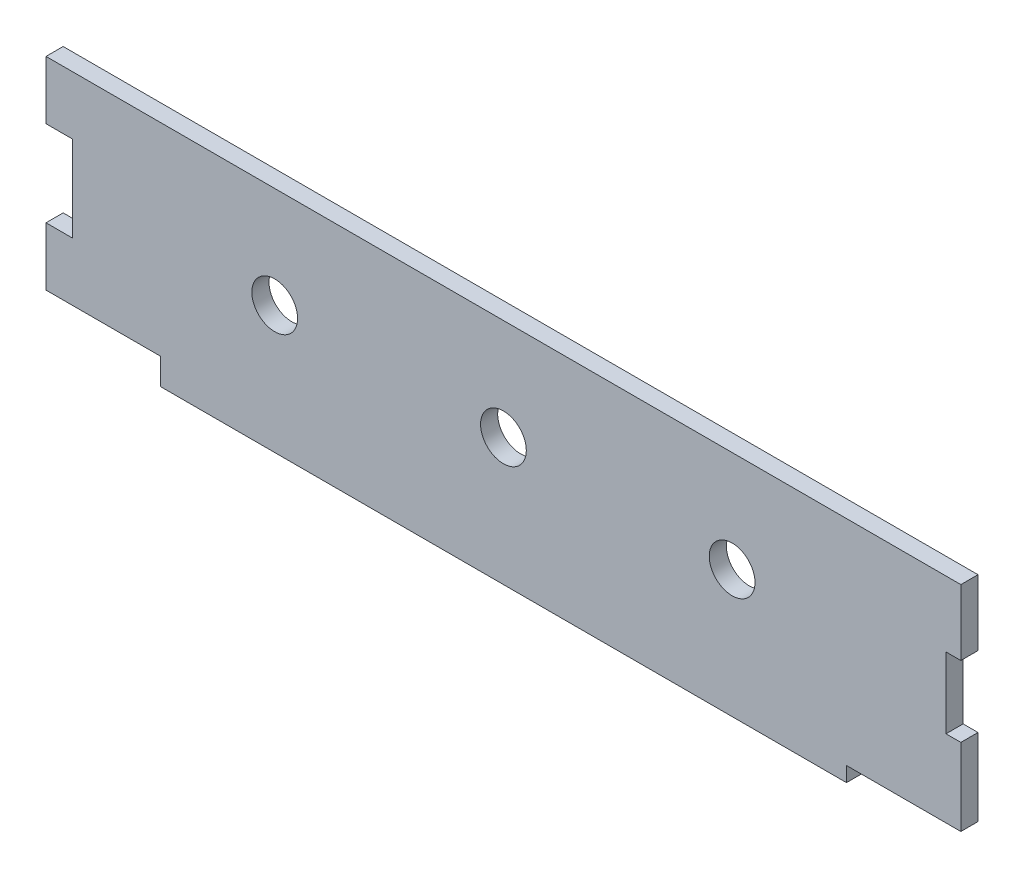
ISO-10303-21;
HEADER;
FILE_DESCRIPTION(('STEP AP214'),'2;1');
FILE_NAME('part.step','',(''),(''),'','','');
FILE_SCHEMA(('AUTOMOTIVE_DESIGN { 1 0 10303 214 1 1 1 1 }'));
ENDSEC;
DATA;
#1=APPLICATION_CONTEXT('core data for automotive mechanical design processes');
#2=APPLICATION_PROTOCOL_DEFINITION('international standard','automotive_design',2000,#1);
#3=PRODUCT_CONTEXT('',#1,'mechanical');
#4=PRODUCT('Part','Part','',(#3));
#5=PRODUCT_RELATED_PRODUCT_CATEGORY('part','',(#4));
#6=PRODUCT_DEFINITION_FORMATION('','',#4);
#7=PRODUCT_DEFINITION_CONTEXT('part definition',#1,'design');
#8=PRODUCT_DEFINITION('design','',#6,#7);
#9=PRODUCT_DEFINITION_SHAPE('','',#8);
#10=(LENGTH_UNIT() NAMED_UNIT(*) SI_UNIT(.MILLI.,.METRE.));
#11=(NAMED_UNIT(*) PLANE_ANGLE_UNIT() SI_UNIT($,.RADIAN.));
#12=(NAMED_UNIT(*) SI_UNIT($,.STERADIAN.) SOLID_ANGLE_UNIT());
#13=UNCERTAINTY_MEASURE_WITH_UNIT(LENGTH_MEASURE(1.E-05),#10,'distance_accuracy_value','');
#14=(GEOMETRIC_REPRESENTATION_CONTEXT(3) GLOBAL_UNCERTAINTY_ASSIGNED_CONTEXT((#13)) GLOBAL_UNIT_ASSIGNED_CONTEXT((#10,
#11,#12)) REPRESENTATION_CONTEXT('',''));
#15=CARTESIAN_POINT('',(0.,0.,0.));
#16=DIRECTION('',(0.,0.,1.));
#17=DIRECTION('',(1.,0.,0.));
#18=AXIS2_PLACEMENT_3D('',#15,#16,#17);
#19=CARTESIAN_POINT('',(0.,0.,1.5));
#20=DIRECTION('',(0.,0.,-1.));
#21=DIRECTION('',(-1.,0.,0.));
#22=AXIS2_PLACEMENT_3D('',#19,#20,#21);
#23=PLANE('',#22);
#24=DIRECTION('',(0.,-1.,0.));
#25=VECTOR('',#24,1.);
#26=CARTESIAN_POINT('',(-40.,3.74999999999999,1.5));
#27=LINE('',#26,#25);
#28=CARTESIAN_POINT('',(-40.0000000000001,8.84999999999999,1.5));
#29=VERTEX_POINT('',#28);
#30=CARTESIAN_POINT('',(-40.,3.74999999999999,1.5));
#31=VERTEX_POINT('',#30);
#32=EDGE_CURVE('E209',#29,#31,#27,.T.);
#33=ORIENTED_EDGE('',*,*,#32,.T.);
#34=DIRECTION('',(1.,0.,0.));
#35=VECTOR('',#34,1.);
#36=CARTESIAN_POINT('',(-37.7,3.74999999999999,1.5));
#37=LINE('',#36,#35);
#38=CARTESIAN_POINT('',(-37.7,3.74999999999999,1.5));
#39=VERTEX_POINT('',#38);
#40=EDGE_CURVE('E117',#31,#39,#37,.T.);
#41=ORIENTED_EDGE('',*,*,#40,.T.);
#42=DIRECTION('',(0.,-1.,0.));
#43=VECTOR('',#42,1.);
#44=CARTESIAN_POINT('',(-37.7,-3.75000000000001,1.5));
#45=LINE('',#44,#43);
#46=CARTESIAN_POINT('',(-37.7,-3.75000000000001,1.5));
#47=VERTEX_POINT('',#46);
#48=EDGE_CURVE('E248',#39,#47,#45,.T.);
#49=ORIENTED_EDGE('',*,*,#48,.T.);
#50=DIRECTION('',(-1.,0.,0.));
#51=VECTOR('',#50,1.);
#52=CARTESIAN_POINT('',(-40.,-3.75000000000001,1.5));
#53=LINE('',#52,#51);
#54=CARTESIAN_POINT('',(-40.,-3.75000000000001,1.5));
#55=VERTEX_POINT('',#54);
#56=EDGE_CURVE('E267',#47,#55,#53,.T.);
#57=ORIENTED_EDGE('',*,*,#56,.T.);
#58=DIRECTION('',(0.,-1.,0.));
#59=VECTOR('',#58,1.);
#60=CARTESIAN_POINT('',(-40.,-8.85000000000001,1.5));
#61=LINE('',#60,#59);
#62=CARTESIAN_POINT('',(-40.,-8.85000000000001,1.5));
#63=VERTEX_POINT('',#62);
#64=EDGE_CURVE('E264',#55,#63,#61,.T.);
#65=ORIENTED_EDGE('',*,*,#64,.T.);
#66=DIRECTION('',(1.,0.,0.));
#67=VECTOR('',#66,1.);
#68=CARTESIAN_POINT('',(-30.,-8.85,1.5));
#69=LINE('',#68,#67);
#70=CARTESIAN_POINT('',(-30.,-8.85,1.5));
#71=VERTEX_POINT('',#70);
#72=EDGE_CURVE('E266',#63,#71,#69,.T.);
#73=ORIENTED_EDGE('',*,*,#72,.T.);
#74=DIRECTION('',(0.,-1.,0.));
#75=VECTOR('',#74,1.);
#76=CARTESIAN_POINT('',(-30.,-11.15,1.5));
#77=LINE('',#76,#75);
#78=CARTESIAN_POINT('',(-30.,-11.15,1.5));
#79=VERTEX_POINT('',#78);
#80=EDGE_CURVE('E269',#71,#79,#77,.T.);
#81=ORIENTED_EDGE('',*,*,#80,.T.);
#82=DIRECTION('',(1.,0.,0.));
#83=VECTOR('',#82,1.);
#84=CARTESIAN_POINT('',(30.,-11.15,1.5));
#85=LINE('',#84,#83);
#86=CARTESIAN_POINT('',(30.,-11.15,1.5));
#87=VERTEX_POINT('',#86);
#88=EDGE_CURVE('E275',#79,#87,#85,.T.);
#89=ORIENTED_EDGE('',*,*,#88,.T.);
#90=DIRECTION('',(0.,1.,0.));
#91=VECTOR('',#90,1.);
#92=CARTESIAN_POINT('',(30.,-9.84999999999999,1.5));
#93=LINE('',#92,#91);
#94=CARTESIAN_POINT('',(30.,-9.84999999999999,1.5));
#95=VERTEX_POINT('',#94);
#96=EDGE_CURVE('E277',#87,#95,#93,.T.);
#97=ORIENTED_EDGE('',*,*,#96,.T.);
#98=DIRECTION('',(1.,0.,0.));
#99=VECTOR('',#98,1.);
#100=CARTESIAN_POINT('',(40.,-9.84999999999999,1.5));
#101=LINE('',#100,#99);
#102=CARTESIAN_POINT('',(40.,-9.84999999999999,1.5));
#103=VERTEX_POINT('',#102);
#104=EDGE_CURVE('E279',#95,#103,#101,.T.);
#105=ORIENTED_EDGE('',*,*,#104,.T.);
#106=DIRECTION('',(0.,1.,0.));
#107=VECTOR('',#106,1.);
#108=CARTESIAN_POINT('',(40.,-3.1,1.5));
#109=LINE('',#108,#107);
#110=CARTESIAN_POINT('',(40.,-3.1,1.5));
#111=VERTEX_POINT('',#110);
#112=EDGE_CURVE('E281',#103,#111,#109,.T.);
#113=ORIENTED_EDGE('',*,*,#112,.T.);
#114=DIRECTION('',(-1.,0.,0.));
#115=VECTOR('',#114,1.);
#116=CARTESIAN_POINT('',(38.7,-3.1,1.5));
#117=LINE('',#116,#115);
#118=CARTESIAN_POINT('',(38.7,-3.1,1.5));
#119=VERTEX_POINT('',#118);
#120=EDGE_CURVE('E283',#111,#119,#117,.T.);
#121=ORIENTED_EDGE('',*,*,#120,.T.);
#122=DIRECTION('',(0.,1.,0.));
#123=VECTOR('',#122,1.);
#124=CARTESIAN_POINT('',(38.7,3.1,1.5));
#125=LINE('',#124,#123);
#126=CARTESIAN_POINT('',(38.7,3.1,1.5));
#127=VERTEX_POINT('',#126);
#128=EDGE_CURVE('E160',#119,#127,#125,.T.);
#129=ORIENTED_EDGE('',*,*,#128,.T.);
#130=DIRECTION('',(1.,0.,0.));
#131=VECTOR('',#130,1.);
#132=CARTESIAN_POINT('',(40.,3.1,1.5));
#133=LINE('',#132,#131);
#134=CARTESIAN_POINT('',(40.,3.1,1.5));
#135=VERTEX_POINT('',#134);
#136=EDGE_CURVE('E154',#127,#135,#133,.T.);
#137=ORIENTED_EDGE('',*,*,#136,.T.);
#138=DIRECTION('',(0.,1.,0.));
#139=VECTOR('',#138,1.);
#140=CARTESIAN_POINT('',(40.0000000000001,8.84999999999999,1.5));
#141=LINE('',#140,#139);
#142=CARTESIAN_POINT('',(40.0000000000001,8.84999999999999,1.5));
#143=VERTEX_POINT('',#142);
#144=EDGE_CURVE('E158',#135,#143,#141,.T.);
#145=ORIENTED_EDGE('',*,*,#144,.T.);
#146=DIRECTION('',(-1.,0.,0.));
#147=VECTOR('',#146,1.);
#148=CARTESIAN_POINT('',(-40.0000000000001,8.84999999999999,1.5));
#149=LINE('',#148,#147);
#150=EDGE_CURVE('E50',#143,#29,#149,.T.);
#151=ORIENTED_EDGE('',*,*,#150,.T.);
#152=EDGE_LOOP('',(#33,#41,#49,#57,#65,#73,#81,#89,#97,#105,#113,#121,#129,#137,#145,#151));
#153=FACE_BOUND('',#152,.T.);
#154=CARTESIAN_POINT('',(20.,0.,1.5));
#155=DIRECTION('',(0.,0.,1.));
#156=DIRECTION('',(1.,0.,0.));
#157=AXIS2_PLACEMENT_3D('',#154,#155,#156);
#158=CIRCLE('',#157,2.00000000000003);
#159=CARTESIAN_POINT('',(22.,0.,1.5));
#160=VERTEX_POINT('',#159);
#161=EDGE_CURVE('E182',#160,#160,#158,.T.);
#162=ORIENTED_EDGE('',*,*,#161,.F.);
#163=EDGE_LOOP('',(#162));
#164=FACE_BOUND('',#163,.T.);
#165=CARTESIAN_POINT('',(0.,0.,1.5));
#166=DIRECTION('',(0.,0.,1.));
#167=DIRECTION('',(1.,0.,0.));
#168=AXIS2_PLACEMENT_3D('',#165,#166,#167);
#169=CIRCLE('',#168,2.00000000000002);
#170=CARTESIAN_POINT('',(2.,0.,1.5));
#171=VERTEX_POINT('',#170);
#172=EDGE_CURVE('E337',#171,#171,#169,.T.);
#173=ORIENTED_EDGE('',*,*,#172,.F.);
#174=EDGE_LOOP('',(#173));
#175=FACE_BOUND('',#174,.T.);
#176=CARTESIAN_POINT('',(-20.,0.,1.5));
#177=DIRECTION('',(0.,0.,1.));
#178=DIRECTION('',(1.,0.,0.));
#179=AXIS2_PLACEMENT_3D('',#176,#177,#178);
#180=CIRCLE('',#179,2.00000000000003);
#181=CARTESIAN_POINT('',(-18.,0.,1.5));
#182=VERTEX_POINT('',#181);
#183=EDGE_CURVE('E328',#182,#182,#180,.T.);
#184=ORIENTED_EDGE('',*,*,#183,.F.);
#185=EDGE_LOOP('',(#184));
#186=FACE_BOUND('',#185,.T.);
#187=ADVANCED_FACE('F33',(#153,#164,#175,#186),#23,.F.);
#188=CARTESIAN_POINT('',(0.,0.,0.));
#189=DIRECTION('',(0.,0.,-1.));
#190=DIRECTION('',(-1.,0.,0.));
#191=AXIS2_PLACEMENT_3D('',#188,#189,#190);
#192=PLANE('',#191);
#193=CARTESIAN_POINT('',(0.,0.,0.));
#194=DIRECTION('',(0.,0.,1.));
#195=DIRECTION('',(1.,0.,0.));
#196=AXIS2_PLACEMENT_3D('',#193,#194,#195);
#197=CIRCLE('',#196,2.00000000000002);
#198=CARTESIAN_POINT('',(2.,0.,0.));
#199=VERTEX_POINT('',#198);
#200=EDGE_CURVE('E334',#199,#199,#197,.T.);
#201=ORIENTED_EDGE('',*,*,#200,.T.);
#202=EDGE_LOOP('',(#201));
#203=FACE_BOUND('',#202,.T.);
#204=DIRECTION('',(0.,-1.,0.));
#205=VECTOR('',#204,1.);
#206=CARTESIAN_POINT('',(-40.,3.74999999999999,0.));
#207=LINE('',#206,#205);
#208=CARTESIAN_POINT('',(-40.0000000000001,8.84999999999999,0.));
#209=VERTEX_POINT('',#208);
#210=CARTESIAN_POINT('',(-40.,3.74999999999999,0.));
#211=VERTEX_POINT('',#210);
#212=EDGE_CURVE('E178',#209,#211,#207,.T.);
#213=ORIENTED_EDGE('',*,*,#212,.F.);
#214=DIRECTION('',(-1.,0.,0.));
#215=VECTOR('',#214,1.);
#216=CARTESIAN_POINT('',(-40.0000000000001,8.84999999999999,0.));
#217=LINE('',#216,#215);
#218=CARTESIAN_POINT('',(40.0000000000001,8.84999999999999,0.));
#219=VERTEX_POINT('',#218);
#220=EDGE_CURVE('E109',#219,#209,#217,.T.);
#221=ORIENTED_EDGE('',*,*,#220,.F.);
#222=DIRECTION('',(0.,1.,0.));
#223=VECTOR('',#222,1.);
#224=CARTESIAN_POINT('',(40.0000000000001,8.84999999999999,0.));
#225=LINE('',#224,#223);
#226=CARTESIAN_POINT('',(40.,3.1,0.));
#227=VERTEX_POINT('',#226);
#228=EDGE_CURVE('E103',#227,#219,#225,.T.);
#229=ORIENTED_EDGE('',*,*,#228,.F.);
#230=DIRECTION('',(1.,0.,0.));
#231=VECTOR('',#230,1.);
#232=CARTESIAN_POINT('',(40.,3.1,0.));
#233=LINE('',#232,#231);
#234=CARTESIAN_POINT('',(38.7,3.1,0.));
#235=VERTEX_POINT('',#234);
#236=EDGE_CURVE('E168',#235,#227,#233,.T.);
#237=ORIENTED_EDGE('',*,*,#236,.F.);
#238=DIRECTION('',(0.,1.,0.));
#239=VECTOR('',#238,1.);
#240=CARTESIAN_POINT('',(38.7,3.1,0.));
#241=LINE('',#240,#239);
#242=CARTESIAN_POINT('',(38.7,-3.1,0.));
#243=VERTEX_POINT('',#242);
#244=EDGE_CURVE('E204',#243,#235,#241,.T.);
#245=ORIENTED_EDGE('',*,*,#244,.F.);
#246=DIRECTION('',(-1.,0.,0.));
#247=VECTOR('',#246,1.);
#248=CARTESIAN_POINT('',(38.7,-3.1,0.));
#249=LINE('',#248,#247);
#250=CARTESIAN_POINT('',(40.,-3.1,0.));
#251=VERTEX_POINT('',#250);
#252=EDGE_CURVE('E202',#251,#243,#249,.T.);
#253=ORIENTED_EDGE('',*,*,#252,.F.);
#254=DIRECTION('',(0.,1.,0.));
#255=VECTOR('',#254,1.);
#256=CARTESIAN_POINT('',(40.,-3.1,0.));
#257=LINE('',#256,#255);
#258=CARTESIAN_POINT('',(40.,-9.84999999999999,0.));
#259=VERTEX_POINT('',#258);
#260=EDGE_CURVE('E200',#259,#251,#257,.T.);
#261=ORIENTED_EDGE('',*,*,#260,.F.);
#262=DIRECTION('',(1.,0.,0.));
#263=VECTOR('',#262,1.);
#264=CARTESIAN_POINT('',(40.,-9.84999999999999,0.));
#265=LINE('',#264,#263);
#266=CARTESIAN_POINT('',(30.,-9.84999999999999,0.));
#267=VERTEX_POINT('',#266);
#268=EDGE_CURVE('E198',#267,#259,#265,.T.);
#269=ORIENTED_EDGE('',*,*,#268,.F.);
#270=DIRECTION('',(0.,1.,0.));
#271=VECTOR('',#270,1.);
#272=CARTESIAN_POINT('',(30.,-9.84999999999999,0.));
#273=LINE('',#272,#271);
#274=CARTESIAN_POINT('',(30.,-11.15,0.));
#275=VERTEX_POINT('',#274);
#276=EDGE_CURVE('E196',#275,#267,#273,.T.);
#277=ORIENTED_EDGE('',*,*,#276,.F.);
#278=DIRECTION('',(1.,0.,0.));
#279=VECTOR('',#278,1.);
#280=CARTESIAN_POINT('',(30.,-11.15,0.));
#281=LINE('',#280,#279);
#282=CARTESIAN_POINT('',(-30.,-11.15,0.));
#283=VERTEX_POINT('',#282);
#284=EDGE_CURVE('E194',#283,#275,#281,.T.);
#285=ORIENTED_EDGE('',*,*,#284,.F.);
#286=DIRECTION('',(0.,-1.,0.));
#287=VECTOR('',#286,1.);
#288=CARTESIAN_POINT('',(-30.,-11.15,0.));
#289=LINE('',#288,#287);
#290=CARTESIAN_POINT('',(-30.,-8.85,0.));
#291=VERTEX_POINT('',#290);
#292=EDGE_CURVE('E192',#291,#283,#289,.T.);
#293=ORIENTED_EDGE('',*,*,#292,.F.);
#294=DIRECTION('',(1.,0.,0.));
#295=VECTOR('',#294,1.);
#296=CARTESIAN_POINT('',(-30.,-8.85,0.));
#297=LINE('',#296,#295);
#298=CARTESIAN_POINT('',(-40.,-8.85000000000001,0.));
#299=VERTEX_POINT('',#298);
#300=EDGE_CURVE('E190',#299,#291,#297,.T.);
#301=ORIENTED_EDGE('',*,*,#300,.F.);
#302=DIRECTION('',(0.,-1.,0.));
#303=VECTOR('',#302,1.);
#304=CARTESIAN_POINT('',(-40.,-8.85000000000001,0.));
#305=LINE('',#304,#303);
#306=CARTESIAN_POINT('',(-40.,-3.75000000000001,0.));
#307=VERTEX_POINT('',#306);
#308=EDGE_CURVE('E188',#307,#299,#305,.T.);
#309=ORIENTED_EDGE('',*,*,#308,.F.);
#310=DIRECTION('',(-1.,0.,0.));
#311=VECTOR('',#310,1.);
#312=CARTESIAN_POINT('',(-40.,-3.75000000000001,0.));
#313=LINE('',#312,#311);
#314=CARTESIAN_POINT('',(-37.7,-3.75000000000001,0.));
#315=VERTEX_POINT('',#314);
#316=EDGE_CURVE('E186',#315,#307,#313,.T.);
#317=ORIENTED_EDGE('',*,*,#316,.F.);
#318=DIRECTION('',(0.,-1.,0.));
#319=VECTOR('',#318,1.);
#320=CARTESIAN_POINT('',(-37.7,-3.75000000000001,0.));
#321=LINE('',#320,#319);
#322=CARTESIAN_POINT('',(-37.7,3.74999999999999,0.));
#323=VERTEX_POINT('',#322);
#324=EDGE_CURVE('E184',#323,#315,#321,.T.);
#325=ORIENTED_EDGE('',*,*,#324,.F.);
#326=DIRECTION('',(1.,0.,0.));
#327=VECTOR('',#326,1.);
#328=CARTESIAN_POINT('',(-37.7,3.74999999999999,0.));
#329=LINE('',#328,#327);
#330=EDGE_CURVE('E181',#211,#323,#329,.T.);
#331=ORIENTED_EDGE('',*,*,#330,.F.);
#332=EDGE_LOOP('',(#213,#221,#229,#237,#245,#253,#261,#269,#277,#285,#293,#301,#309,#317,#325,#331));
#333=FACE_BOUND('',#332,.T.);
#334=CARTESIAN_POINT('',(20.,0.,0.));
#335=DIRECTION('',(0.,0.,1.));
#336=DIRECTION('',(1.,0.,0.));
#337=AXIS2_PLACEMENT_3D('',#334,#335,#336);
#338=CIRCLE('',#337,2.00000000000003);
#339=CARTESIAN_POINT('',(22.,0.,0.));
#340=VERTEX_POINT('',#339);
#341=EDGE_CURVE('E340',#340,#340,#338,.T.);
#342=ORIENTED_EDGE('',*,*,#341,.T.);
#343=EDGE_LOOP('',(#342));
#344=FACE_BOUND('',#343,.T.);
#345=CARTESIAN_POINT('',(-20.,0.,0.));
#346=DIRECTION('',(0.,0.,1.));
#347=DIRECTION('',(1.,0.,0.));
#348=AXIS2_PLACEMENT_3D('',#345,#346,#347);
#349=CIRCLE('',#348,2.00000000000003);
#350=CARTESIAN_POINT('',(-18.,0.,0.));
#351=VERTEX_POINT('',#350);
#352=EDGE_CURVE('E331',#351,#351,#349,.T.);
#353=ORIENTED_EDGE('',*,*,#352,.T.);
#354=EDGE_LOOP('',(#353));
#355=FACE_BOUND('',#354,.T.);
#356=ADVANCED_FACE('F252',(#203,#333,#344,#355),#192,.T.);
#357=CARTESIAN_POINT('',(-40.,3.74999999999999,1.5));
#358=DIRECTION('',(1.,0.,0.));
#359=DIRECTION('',(0.,1.,0.));
#360=AXIS2_PLACEMENT_3D('',#357,#358,#359);
#361=PLANE('',#360);
#362=ORIENTED_EDGE('',*,*,#212,.T.);
#363=DIRECTION('',(0.,0.,-1.));
#364=VECTOR('',#363,1.);
#365=CARTESIAN_POINT('',(-40.,3.74999999999999,1.5));
#366=LINE('',#365,#364);
#367=EDGE_CURVE('E11',#31,#211,#366,.T.);
#368=ORIENTED_EDGE('',*,*,#367,.F.);
#369=ORIENTED_EDGE('',*,*,#32,.F.);
#370=DIRECTION('',(0.,0.,-1.));
#371=VECTOR('',#370,1.);
#372=CARTESIAN_POINT('',(-40.0000000000001,8.84999999999999,1.5));
#373=LINE('',#372,#371);
#374=EDGE_CURVE('E174',#29,#209,#373,.T.);
#375=ORIENTED_EDGE('',*,*,#374,.T.);
#376=EDGE_LOOP('',(#362,#368,#369,#375));
#377=FACE_BOUND('',#376,.T.);
#378=ADVANCED_FACE('F35',(#377),#361,.F.);
#379=CARTESIAN_POINT('',(-37.7,3.74999999999999,1.5));
#380=DIRECTION('',(0.,1.,0.));
#381=DIRECTION('',(-1.,0.,0.));
#382=AXIS2_PLACEMENT_3D('',#379,#380,#381);
#383=PLANE('',#382);
#384=ORIENTED_EDGE('',*,*,#330,.T.);
#385=DIRECTION('',(0.,0.,-1.));
#386=VECTOR('',#385,1.);
#387=CARTESIAN_POINT('',(-37.7,3.74999999999999,1.5));
#388=LINE('',#387,#386);
#389=EDGE_CURVE('E42',#39,#323,#388,.T.);
#390=ORIENTED_EDGE('',*,*,#389,.F.);
#391=ORIENTED_EDGE('',*,*,#40,.F.);
#392=ORIENTED_EDGE('',*,*,#367,.T.);
#393=EDGE_LOOP('',(#384,#390,#391,#392));
#394=FACE_BOUND('',#393,.T.);
#395=ADVANCED_FACE('F483',(#394),#383,.F.);
#396=CARTESIAN_POINT('',(-37.7,-3.75000000000001,1.5));
#397=DIRECTION('',(1.,0.,0.));
#398=DIRECTION('',(0.,1.,0.));
#399=AXIS2_PLACEMENT_3D('',#396,#397,#398);
#400=PLANE('',#399);
#401=ORIENTED_EDGE('',*,*,#324,.T.);
#402=DIRECTION('',(0.,0.,-1.));
#403=VECTOR('',#402,1.);
#404=CARTESIAN_POINT('',(-37.7,-3.75000000000001,1.5));
#405=LINE('',#404,#403);
#406=EDGE_CURVE('E240',#47,#315,#405,.T.);
#407=ORIENTED_EDGE('',*,*,#406,.F.);
#408=ORIENTED_EDGE('',*,*,#48,.F.);
#409=ORIENTED_EDGE('',*,*,#389,.T.);
#410=EDGE_LOOP('',(#401,#407,#408,#409));
#411=FACE_BOUND('',#410,.T.);
#412=ADVANCED_FACE('F246',(#411),#400,.F.);
#413=CARTESIAN_POINT('',(-40.,-3.75000000000001,1.5));
#414=DIRECTION('',(0.,-1.,0.));
#415=DIRECTION('',(0.,0.,-1.));
#416=AXIS2_PLACEMENT_3D('',#413,#414,#415);
#417=PLANE('',#416);
#418=ORIENTED_EDGE('',*,*,#316,.T.);
#419=DIRECTION('',(0.,0.,-1.));
#420=VECTOR('',#419,1.);
#421=CARTESIAN_POINT('',(-40.,-3.75000000000001,1.5));
#422=LINE('',#421,#420);
#423=EDGE_CURVE('E237',#55,#307,#422,.T.);
#424=ORIENTED_EDGE('',*,*,#423,.F.);
#425=ORIENTED_EDGE('',*,*,#56,.F.);
#426=ORIENTED_EDGE('',*,*,#406,.T.);
#427=EDGE_LOOP('',(#418,#424,#425,#426));
#428=FACE_BOUND('',#427,.T.);
#429=ADVANCED_FACE('F258',(#428),#417,.F.);
#430=CARTESIAN_POINT('',(-40.,-8.85000000000001,1.5));
#431=DIRECTION('',(1.,0.,0.));
#432=DIRECTION('',(0.,1.,0.));
#433=AXIS2_PLACEMENT_3D('',#430,#431,#432);
#434=PLANE('',#433);
#435=ORIENTED_EDGE('',*,*,#308,.T.);
#436=DIRECTION('',(0.,0.,-1.));
#437=VECTOR('',#436,1.);
#438=CARTESIAN_POINT('',(-40.,-8.85000000000001,1.5));
#439=LINE('',#438,#437);
#440=EDGE_CURVE('E234',#63,#299,#439,.T.);
#441=ORIENTED_EDGE('',*,*,#440,.F.);
#442=ORIENTED_EDGE('',*,*,#64,.F.);
#443=ORIENTED_EDGE('',*,*,#423,.T.);
#444=EDGE_LOOP('',(#435,#441,#442,#443));
#445=FACE_BOUND('',#444,.T.);
#446=ADVANCED_FACE('F262',(#445),#434,.F.);
#447=CARTESIAN_POINT('',(-30.,-8.85,1.5));
#448=DIRECTION('',(0.,1.,0.));
#449=DIRECTION('',(-1.,0.,0.));
#450=AXIS2_PLACEMENT_3D('',#447,#448,#449);
#451=PLANE('',#450);
#452=ORIENTED_EDGE('',*,*,#300,.T.);
#453=DIRECTION('',(0.,0.,-1.));
#454=VECTOR('',#453,1.);
#455=CARTESIAN_POINT('',(-30.,-8.85,1.5));
#456=LINE('',#455,#454);
#457=EDGE_CURVE('E231',#71,#291,#456,.T.);
#458=ORIENTED_EDGE('',*,*,#457,.F.);
#459=ORIENTED_EDGE('',*,*,#72,.F.);
#460=ORIENTED_EDGE('',*,*,#440,.T.);
#461=EDGE_LOOP('',(#452,#458,#459,#460));
#462=FACE_BOUND('',#461,.T.);
#463=ADVANCED_FACE('F448',(#462),#451,.F.);
#464=CARTESIAN_POINT('',(-30.,-11.15,1.5));
#465=DIRECTION('',(1.,0.,0.));
#466=DIRECTION('',(0.,1.,0.));
#467=AXIS2_PLACEMENT_3D('',#464,#465,#466);
#468=PLANE('',#467);
#469=ORIENTED_EDGE('',*,*,#292,.T.);
#470=DIRECTION('',(0.,0.,-1.));
#471=VECTOR('',#470,1.);
#472=CARTESIAN_POINT('',(-30.,-11.15,1.5));
#473=LINE('',#472,#471);
#474=EDGE_CURVE('E228',#79,#283,#473,.T.);
#475=ORIENTED_EDGE('',*,*,#474,.F.);
#476=ORIENTED_EDGE('',*,*,#80,.F.);
#477=ORIENTED_EDGE('',*,*,#457,.T.);
#478=EDGE_LOOP('',(#469,#475,#476,#477));
#479=FACE_BOUND('',#478,.T.);
#480=ADVANCED_FACE('F438',(#479),#468,.F.);
#481=CARTESIAN_POINT('',(30.,-11.15,1.5));
#482=DIRECTION('',(0.,1.,0.));
#483=DIRECTION('',(-1.,0.,0.));
#484=AXIS2_PLACEMENT_3D('',#481,#482,#483);
#485=PLANE('',#484);
#486=ORIENTED_EDGE('',*,*,#284,.T.);
#487=DIRECTION('',(0.,0.,-1.));
#488=VECTOR('',#487,1.);
#489=CARTESIAN_POINT('',(30.,-11.15,1.5));
#490=LINE('',#489,#488);
#491=EDGE_CURVE('E225',#87,#275,#490,.T.);
#492=ORIENTED_EDGE('',*,*,#491,.F.);
#493=ORIENTED_EDGE('',*,*,#88,.F.);
#494=ORIENTED_EDGE('',*,*,#474,.T.);
#495=EDGE_LOOP('',(#486,#492,#493,#494));
#496=FACE_BOUND('',#495,.T.);
#497=ADVANCED_FACE('F428',(#496),#485,.F.);
#498=CARTESIAN_POINT('',(30.,-9.84999999999999,1.5));
#499=DIRECTION('',(-1.,0.,0.));
#500=DIRECTION('',(0.,-1.,0.));
#501=AXIS2_PLACEMENT_3D('',#498,#499,#500);
#502=PLANE('',#501);
#503=ORIENTED_EDGE('',*,*,#276,.T.);
#504=DIRECTION('',(0.,0.,-1.));
#505=VECTOR('',#504,1.);
#506=CARTESIAN_POINT('',(30.,-9.84999999999999,1.5));
#507=LINE('',#506,#505);
#508=EDGE_CURVE('E222',#95,#267,#507,.T.);
#509=ORIENTED_EDGE('',*,*,#508,.F.);
#510=ORIENTED_EDGE('',*,*,#96,.F.);
#511=ORIENTED_EDGE('',*,*,#491,.T.);
#512=EDGE_LOOP('',(#503,#509,#510,#511));
#513=FACE_BOUND('',#512,.T.);
#514=ADVANCED_FACE('F418',(#513),#502,.F.);
#515=CARTESIAN_POINT('',(40.,-9.84999999999999,1.5));
#516=DIRECTION('',(0.,1.,0.));
#517=DIRECTION('',(-1.,0.,0.));
#518=AXIS2_PLACEMENT_3D('',#515,#516,#517);
#519=PLANE('',#518);
#520=ORIENTED_EDGE('',*,*,#268,.T.);
#521=DIRECTION('',(0.,0.,-1.));
#522=VECTOR('',#521,1.);
#523=CARTESIAN_POINT('',(40.,-9.84999999999999,1.5));
#524=LINE('',#523,#522);
#525=EDGE_CURVE('E219',#103,#259,#524,.T.);
#526=ORIENTED_EDGE('',*,*,#525,.F.);
#527=ORIENTED_EDGE('',*,*,#104,.F.);
#528=ORIENTED_EDGE('',*,*,#508,.T.);
#529=EDGE_LOOP('',(#520,#526,#527,#528));
#530=FACE_BOUND('',#529,.T.);
#531=ADVANCED_FACE('F408',(#530),#519,.F.);
#532=CARTESIAN_POINT('',(40.,-3.1,1.5));
#533=DIRECTION('',(-1.,0.,0.));
#534=DIRECTION('',(0.,-1.,0.));
#535=AXIS2_PLACEMENT_3D('',#532,#533,#534);
#536=PLANE('',#535);
#537=ORIENTED_EDGE('',*,*,#260,.T.);
#538=DIRECTION('',(0.,0.,-1.));
#539=VECTOR('',#538,1.);
#540=CARTESIAN_POINT('',(40.,-3.1,1.5));
#541=LINE('',#540,#539);
#542=EDGE_CURVE('E216',#111,#251,#541,.T.);
#543=ORIENTED_EDGE('',*,*,#542,.F.);
#544=ORIENTED_EDGE('',*,*,#112,.F.);
#545=ORIENTED_EDGE('',*,*,#525,.T.);
#546=EDGE_LOOP('',(#537,#543,#544,#545));
#547=FACE_BOUND('',#546,.T.);
#548=ADVANCED_FACE('F399',(#547),#536,.F.);
#549=CARTESIAN_POINT('',(38.7,-3.1,1.5));
#550=DIRECTION('',(0.,-1.,0.));
#551=DIRECTION('',(0.,0.,-1.));
#552=AXIS2_PLACEMENT_3D('',#549,#550,#551);
#553=PLANE('',#552);
#554=ORIENTED_EDGE('',*,*,#252,.T.);
#555=DIRECTION('',(0.,0.,-1.));
#556=VECTOR('',#555,1.);
#557=CARTESIAN_POINT('',(38.7,-3.1,1.5));
#558=LINE('',#557,#556);
#559=EDGE_CURVE('E213',#119,#243,#558,.T.);
#560=ORIENTED_EDGE('',*,*,#559,.F.);
#561=ORIENTED_EDGE('',*,*,#120,.F.);
#562=ORIENTED_EDGE('',*,*,#542,.T.);
#563=EDGE_LOOP('',(#554,#560,#561,#562));
#564=FACE_BOUND('',#563,.T.);
#565=ADVANCED_FACE('F289',(#564),#553,.F.);
#566=CARTESIAN_POINT('',(38.7,3.1,1.5));
#567=DIRECTION('',(-1.,0.,0.));
#568=DIRECTION('',(0.,0.,1.));
#569=AXIS2_PLACEMENT_3D('',#566,#567,#568);
#570=PLANE('',#569);
#571=ORIENTED_EDGE('',*,*,#244,.T.);
#572=DIRECTION('',(0.,0.,-1.));
#573=VECTOR('',#572,1.);
#574=CARTESIAN_POINT('',(38.7,3.1,1.5));
#575=LINE('',#574,#573);
#576=EDGE_CURVE('E169',#127,#235,#575,.T.);
#577=ORIENTED_EDGE('',*,*,#576,.F.);
#578=ORIENTED_EDGE('',*,*,#128,.F.);
#579=ORIENTED_EDGE('',*,*,#559,.T.);
#580=EDGE_LOOP('',(#571,#577,#578,#579));
#581=FACE_BOUND('',#580,.T.);
#582=ADVANCED_FACE('F293',(#581),#570,.F.);
#583=CARTESIAN_POINT('',(40.,3.1,1.5));
#584=DIRECTION('',(0.,1.,0.));
#585=DIRECTION('',(0.,0.,1.));
#586=AXIS2_PLACEMENT_3D('',#583,#584,#585);
#587=PLANE('',#586);
#588=ORIENTED_EDGE('',*,*,#236,.T.);
#589=DIRECTION('',(0.,0.,-1.));
#590=VECTOR('',#589,1.);
#591=CARTESIAN_POINT('',(40.,3.1,1.5));
#592=LINE('',#591,#590);
#593=EDGE_CURVE('E165',#135,#227,#592,.T.);
#594=ORIENTED_EDGE('',*,*,#593,.F.);
#595=ORIENTED_EDGE('',*,*,#136,.F.);
#596=ORIENTED_EDGE('',*,*,#576,.T.);
#597=EDGE_LOOP('',(#588,#594,#595,#596));
#598=FACE_BOUND('',#597,.T.);
#599=ADVANCED_FACE('F166',(#598),#587,.F.);
#600=CARTESIAN_POINT('',(40.0000000000001,8.84999999999999,1.5));
#601=DIRECTION('',(-1.,0.,0.));
#602=DIRECTION('',(0.,-1.,0.));
#603=AXIS2_PLACEMENT_3D('',#600,#601,#602);
#604=PLANE('',#603);
#605=ORIENTED_EDGE('',*,*,#228,.T.);
#606=DIRECTION('',(0.,0.,-1.));
#607=VECTOR('',#606,1.);
#608=CARTESIAN_POINT('',(40.0000000000001,8.84999999999999,1.5));
#609=LINE('',#608,#607);
#610=EDGE_CURVE('E170',#143,#219,#609,.T.);
#611=ORIENTED_EDGE('',*,*,#610,.F.);
#612=ORIENTED_EDGE('',*,*,#144,.F.);
#613=ORIENTED_EDGE('',*,*,#593,.T.);
#614=EDGE_LOOP('',(#605,#611,#612,#613));
#615=FACE_BOUND('',#614,.T.);
#616=ADVANCED_FACE('F172',(#615),#604,.F.);
#617=CARTESIAN_POINT('',(-40.0000000000001,8.84999999999999,1.5));
#618=DIRECTION('',(0.,-1.,0.));
#619=DIRECTION('',(0.,0.,-1.));
#620=AXIS2_PLACEMENT_3D('',#617,#618,#619);
#621=PLANE('',#620);
#622=ORIENTED_EDGE('',*,*,#220,.T.);
#623=ORIENTED_EDGE('',*,*,#374,.F.);
#624=ORIENTED_EDGE('',*,*,#150,.F.);
#625=ORIENTED_EDGE('',*,*,#610,.T.);
#626=EDGE_LOOP('',(#622,#623,#624,#625));
#627=FACE_BOUND('',#626,.T.);
#628=ADVANCED_FACE('F297',(#627),#621,.F.);
#629=CARTESIAN_POINT('',(20.,0.,1.5));
#630=DIRECTION('',(0.,0.,-1.));
#631=DIRECTION('',(-1.,0.,0.));
#632=AXIS2_PLACEMENT_3D('',#629,#630,#631);
#633=CYLINDRICAL_SURFACE('',#632,2.00000000000003);
#634=ORIENTED_EDGE('',*,*,#161,.T.);
#635=EDGE_LOOP('',(#634));
#636=FACE_BOUND('',#635,.T.);
#637=ORIENTED_EDGE('',*,*,#341,.F.);
#638=EDGE_LOOP('',(#637));
#639=FACE_BOUND('',#638,.T.);
#640=ADVANCED_FACE('F299',(#636,#639),#633,.F.);
#641=CARTESIAN_POINT('',(0.,0.,1.5));
#642=DIRECTION('',(0.,0.,-1.));
#643=DIRECTION('',(-1.,0.,0.));
#644=AXIS2_PLACEMENT_3D('',#641,#642,#643);
#645=CYLINDRICAL_SURFACE('',#644,2.00000000000002);
#646=ORIENTED_EDGE('',*,*,#172,.T.);
#647=EDGE_LOOP('',(#646));
#648=FACE_BOUND('',#647,.T.);
#649=ORIENTED_EDGE('',*,*,#200,.F.);
#650=EDGE_LOOP('',(#649));
#651=FACE_BOUND('',#650,.T.);
#652=ADVANCED_FACE('F305',(#648,#651),#645,.F.);
#653=CARTESIAN_POINT('',(-20.,0.,1.5));
#654=DIRECTION('',(0.,0.,-1.));
#655=DIRECTION('',(-1.,0.,0.));
#656=AXIS2_PLACEMENT_3D('',#653,#654,#655);
#657=CYLINDRICAL_SURFACE('',#656,2.00000000000003);
#658=ORIENTED_EDGE('',*,*,#183,.T.);
#659=EDGE_LOOP('',(#658));
#660=FACE_BOUND('',#659,.T.);
#661=ORIENTED_EDGE('',*,*,#352,.F.);
#662=EDGE_LOOP('',(#661));
#663=FACE_BOUND('',#662,.T.);
#664=ADVANCED_FACE('F319',(#660,#663),#657,.F.);
#665=CLOSED_SHELL('',(#187,#356,#378,#395,#412,#429,#446,#463,#480,#497,#514,#531,#548,#565,
#582,#599,#616,#628,#640,#652,#664));
#666=MANIFOLD_SOLID_BREP('B2',#665);
#667=ADVANCED_BREP_SHAPE_REPRESENTATION('',(#18,#666),#14);
#668=SHAPE_DEFINITION_REPRESENTATION(#9,#667);
ENDSEC;
END-ISO-10303-21;
